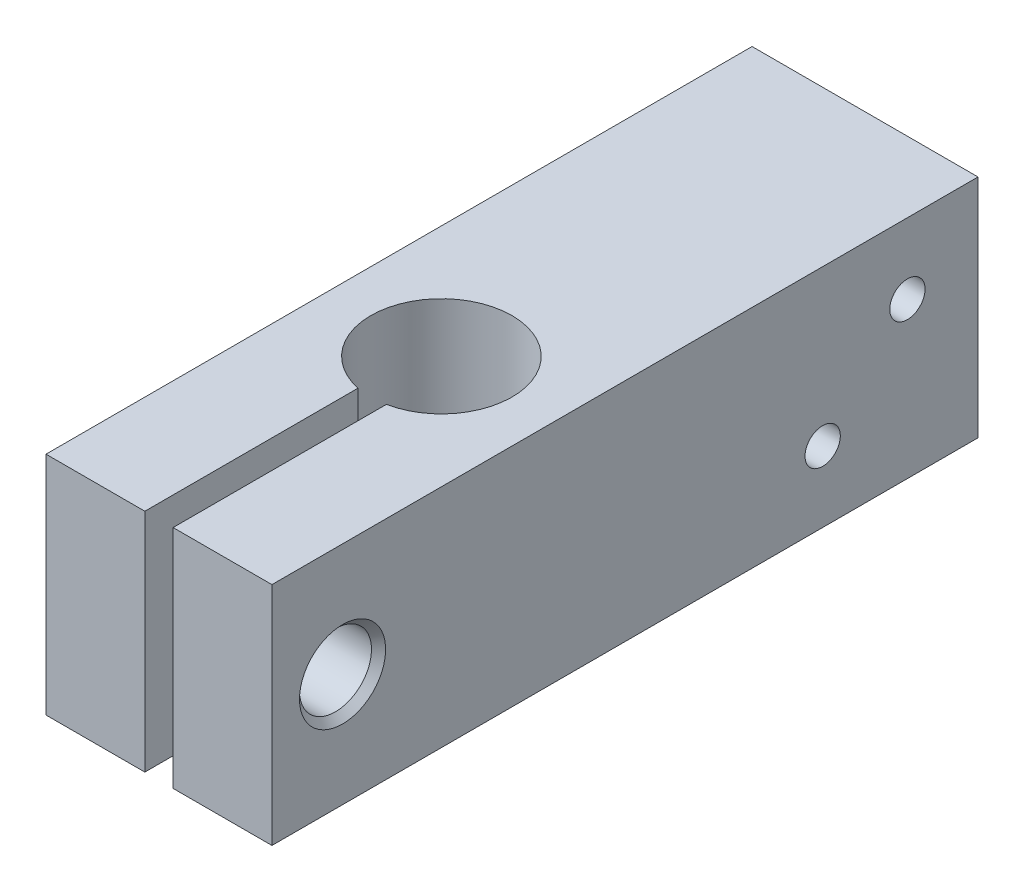
ISO-10303-21;
HEADER;
FILE_DESCRIPTION(('STEP AP214'),'2;1');
FILE_NAME('part.step','',(''),(''),'','','');
FILE_SCHEMA(('AUTOMOTIVE_DESIGN { 1 0 10303 214 1 1 1 1 }'));
ENDSEC;
DATA;
#1=APPLICATION_CONTEXT('core data for automotive mechanical design processes');
#2=APPLICATION_PROTOCOL_DEFINITION('international standard','automotive_design',2000,#1);
#3=PRODUCT_CONTEXT('',#1,'mechanical');
#4=PRODUCT('Part','Part','',(#3));
#5=PRODUCT_RELATED_PRODUCT_CATEGORY('part','',(#4));
#6=PRODUCT_DEFINITION_FORMATION('','',#4);
#7=PRODUCT_DEFINITION_CONTEXT('part definition',#1,'design');
#8=PRODUCT_DEFINITION('design','',#6,#7);
#9=PRODUCT_DEFINITION_SHAPE('','',#8);
#10=(LENGTH_UNIT() NAMED_UNIT(*) SI_UNIT(.MILLI.,.METRE.));
#11=(NAMED_UNIT(*) PLANE_ANGLE_UNIT() SI_UNIT($,.RADIAN.));
#12=(NAMED_UNIT(*) SI_UNIT($,.STERADIAN.) SOLID_ANGLE_UNIT());
#13=UNCERTAINTY_MEASURE_WITH_UNIT(LENGTH_MEASURE(1.E-05),#10,'distance_accuracy_value','');
#14=(GEOMETRIC_REPRESENTATION_CONTEXT(3) GLOBAL_UNCERTAINTY_ASSIGNED_CONTEXT((#13)) GLOBAL_UNIT_ASSIGNED_CONTEXT((#10,
#11,#12)) REPRESENTATION_CONTEXT('',''));
#15=CARTESIAN_POINT('',(0.,0.,0.));
#16=DIRECTION('',(0.,0.,1.));
#17=DIRECTION('',(1.,0.,0.));
#18=AXIS2_PLACEMENT_3D('',#15,#16,#17);
#19=CARTESIAN_POINT('',(0.,0.,50.));
#20=DIRECTION('',(0.,0.,1.));
#21=DIRECTION('',(1.,0.,0.));
#22=AXIS2_PLACEMENT_3D('',#19,#20,#21);
#23=PLANE('',#22);
#24=DIRECTION('',(1.,0.,0.));
#25=VECTOR('',#24,1.);
#26=CARTESIAN_POINT('',(8.,-8.,50.));
#27=LINE('',#26,#25);
#28=CARTESIAN_POINT('',(-8.,-8.,50.));
#29=VERTEX_POINT('',#28);
#30=CARTESIAN_POINT('',(-0.999999999999995,-8.,50.));
#31=VERTEX_POINT('',#30);
#32=EDGE_CURVE('E94',#29,#31,#27,.T.);
#33=ORIENTED_EDGE('',*,*,#32,.T.);
#34=DIRECTION('',(0.,1.,0.));
#35=VECTOR('',#34,1.);
#36=CARTESIAN_POINT('',(-0.999999999999995,-8.,50.));
#37=LINE('',#36,#35);
#38=CARTESIAN_POINT('',(-0.999999999999997,8.,50.));
#39=VERTEX_POINT('',#38);
#40=EDGE_CURVE('E119',#31,#39,#37,.T.);
#41=ORIENTED_EDGE('',*,*,#40,.T.);
#42=DIRECTION('',(-1.,0.,0.));
#43=VECTOR('',#42,1.);
#44=CARTESIAN_POINT('',(8.,8.,50.));
#45=LINE('',#44,#43);
#46=CARTESIAN_POINT('',(-8.,8.,50.));
#47=VERTEX_POINT('',#46);
#48=EDGE_CURVE('E64',#39,#47,#45,.T.);
#49=ORIENTED_EDGE('',*,*,#48,.T.);
#50=DIRECTION('',(0.,-1.,0.));
#51=VECTOR('',#50,1.);
#52=CARTESIAN_POINT('',(-8.,-8.,50.));
#53=LINE('',#52,#51);
#54=EDGE_CURVE('E150',#47,#29,#53,.T.);
#55=ORIENTED_EDGE('',*,*,#54,.T.);
#56=EDGE_LOOP('',(#33,#41,#49,#55));
#57=FACE_BOUND('',#56,.T.);
#58=ADVANCED_FACE('F40',(#57),#23,.T.);
#59=CARTESIAN_POINT('',(-8.,-8.,50.));
#60=DIRECTION('',(1.,0.,0.));
#61=DIRECTION('',(0.,0.,-1.));
#62=AXIS2_PLACEMENT_3D('',#59,#60,#61);
#63=PLANE('',#62);
#64=CARTESIAN_POINT('',(-8.,3.,5.));
#65=DIRECTION('',(-1.,0.,0.));
#66=DIRECTION('',(0.,0.,1.));
#67=AXIS2_PLACEMENT_3D('',#64,#65,#66);
#68=CIRCLE('',#67,1.24999999999999);
#69=CARTESIAN_POINT('',(-8.,3.,6.24999999999999));
#70=VERTEX_POINT('',#69);
#71=EDGE_CURVE('E248',#70,#70,#68,.T.);
#72=ORIENTED_EDGE('',*,*,#71,.F.);
#73=EDGE_LOOP('',(#72));
#74=FACE_BOUND('',#73,.T.);
#75=CARTESIAN_POINT('',(-8.,-3.,11.));
#76=DIRECTION('',(-1.,0.,0.));
#77=DIRECTION('',(0.,0.,1.));
#78=AXIS2_PLACEMENT_3D('',#75,#76,#77);
#79=CIRCLE('',#78,1.24999999999999);
#80=CARTESIAN_POINT('',(-8.,-3.,12.25));
#81=VERTEX_POINT('',#80);
#82=EDGE_CURVE('E250',#81,#81,#79,.T.);
#83=ORIENTED_EDGE('',*,*,#82,.F.);
#84=EDGE_LOOP('',(#83));
#85=FACE_BOUND('',#84,.T.);
#86=CARTESIAN_POINT('',(-8.,0.,45.));
#87=DIRECTION('',(-1.,0.,0.));
#88=DIRECTION('',(0.,0.,1.));
#89=AXIS2_PLACEMENT_3D('',#86,#87,#88);
#90=CIRCLE('',#89,2.1);
#91=CARTESIAN_POINT('',(-8.,0.,47.1));
#92=VERTEX_POINT('',#91);
#93=EDGE_CURVE('E258',#92,#92,#90,.T.);
#94=ORIENTED_EDGE('',*,*,#93,.F.);
#95=EDGE_LOOP('',(#94));
#96=FACE_BOUND('',#95,.T.);
#97=DIRECTION('',(0.,-1.,0.));
#98=VECTOR('',#97,1.);
#99=CARTESIAN_POINT('',(-8.,-8.,0.));
#100=LINE('',#99,#98);
#101=CARTESIAN_POINT('',(-8.,8.,0.));
#102=VERTEX_POINT('',#101);
#103=CARTESIAN_POINT('',(-8.,-8.,0.));
#104=VERTEX_POINT('',#103);
#105=EDGE_CURVE('E146',#102,#104,#100,.T.);
#106=ORIENTED_EDGE('',*,*,#105,.T.);
#107=DIRECTION('',(0.,0.,-1.));
#108=VECTOR('',#107,1.);
#109=CARTESIAN_POINT('',(-8.,-8.,50.));
#110=LINE('',#109,#108);
#111=EDGE_CURVE('E173',#29,#104,#110,.T.);
#112=ORIENTED_EDGE('',*,*,#111,.F.);
#113=ORIENTED_EDGE('',*,*,#54,.F.);
#114=DIRECTION('',(0.,0.,-1.));
#115=VECTOR('',#114,1.);
#116=CARTESIAN_POINT('',(-8.,8.,50.));
#117=LINE('',#116,#115);
#118=EDGE_CURVE('E159',#47,#102,#117,.T.);
#119=ORIENTED_EDGE('',*,*,#118,.T.);
#120=EDGE_LOOP('',(#106,#112,#113,#119));
#121=FACE_BOUND('',#120,.T.);
#122=ADVANCED_FACE('F193',(#74,#85,#96,#121),#63,.F.);
#123=CARTESIAN_POINT('',(8.,-8.,50.));
#124=DIRECTION('',(0.,1.,0.));
#125=DIRECTION('',(-1.,0.,0.));
#126=AXIS2_PLACEMENT_3D('',#123,#124,#125);
#127=PLANE('',#126);
#128=CARTESIAN_POINT('',(1.00000000000001,-8.,50.));
#129=VERTEX_POINT('',#128);
#130=CARTESIAN_POINT('',(8.,-8.,50.));
#131=VERTEX_POINT('',#130);
#132=EDGE_CURVE('E152',#129,#131,#27,.T.);
#133=ORIENTED_EDGE('',*,*,#132,.F.);
#134=DIRECTION('',(0.,0.,-1.));
#135=VECTOR('',#134,1.);
#136=CARTESIAN_POINT('',(1.00000000000001,-8.,0.));
#137=LINE('',#136,#135);
#138=CARTESIAN_POINT('',(1.00000000000001,-8.,34.8989794855664));
#139=VERTEX_POINT('',#138);
#140=EDGE_CURVE('E121',#129,#139,#137,.T.);
#141=ORIENTED_EDGE('',*,*,#140,.T.);
#142=CARTESIAN_POINT('',(0.,-8.,30.));
#143=DIRECTION('',(0.,1.,0.));
#144=DIRECTION('',(-1.,0.,0.));
#145=AXIS2_PLACEMENT_3D('',#142,#143,#144);
#146=CIRCLE('',#145,5.);
#147=CARTESIAN_POINT('',(-0.999999999999997,-8.,34.8989794855664));
#148=VERTEX_POINT('',#147);
#149=EDGE_CURVE('E122',#139,#148,#146,.T.);
#150=ORIENTED_EDGE('',*,*,#149,.T.);
#151=DIRECTION('',(0.,0.,-1.));
#152=VECTOR('',#151,1.);
#153=CARTESIAN_POINT('',(-1.,-8.,0.));
#154=LINE('',#153,#152);
#155=EDGE_CURVE('E114',#31,#148,#154,.T.);
#156=ORIENTED_EDGE('',*,*,#155,.F.);
#157=ORIENTED_EDGE('',*,*,#32,.F.);
#158=ORIENTED_EDGE('',*,*,#111,.T.);
#159=DIRECTION('',(1.,0.,0.));
#160=VECTOR('',#159,1.);
#161=CARTESIAN_POINT('',(8.,-8.,0.));
#162=LINE('',#161,#160);
#163=CARTESIAN_POINT('',(8.,-8.,0.));
#164=VERTEX_POINT('',#163);
#165=EDGE_CURVE('E162',#104,#164,#162,.T.);
#166=ORIENTED_EDGE('',*,*,#165,.T.);
#167=DIRECTION('',(0.,0.,-1.));
#168=VECTOR('',#167,1.);
#169=CARTESIAN_POINT('',(8.,-8.,50.));
#170=LINE('',#169,#168);
#171=EDGE_CURVE('E170',#131,#164,#170,.T.);
#172=ORIENTED_EDGE('',*,*,#171,.F.);
#173=EDGE_LOOP('',(#133,#141,#150,#156,#157,#158,#166,#172));
#174=FACE_BOUND('',#173,.T.);
#175=ADVANCED_FACE('F132',(#174),#127,.F.);
#176=CARTESIAN_POINT('',(8.,-8.,50.));
#177=DIRECTION('',(-1.,0.,0.));
#178=DIRECTION('',(0.,0.,1.));
#179=AXIS2_PLACEMENT_3D('',#176,#177,#178);
#180=PLANE('',#179);
#181=CARTESIAN_POINT('',(8.,3.,5.));
#182=DIRECTION('',(-1.,0.,0.));
#183=DIRECTION('',(0.,0.,1.));
#184=AXIS2_PLACEMENT_3D('',#181,#182,#183);
#185=CIRCLE('',#184,1.25);
#186=CARTESIAN_POINT('',(8.,3.,6.25));
#187=VERTEX_POINT('',#186);
#188=EDGE_CURVE('E245',#187,#187,#185,.T.);
#189=ORIENTED_EDGE('',*,*,#188,.T.);
#190=EDGE_LOOP('',(#189));
#191=FACE_BOUND('',#190,.T.);
#192=CARTESIAN_POINT('',(8.,-3.,11.));
#193=DIRECTION('',(-1.,0.,0.));
#194=DIRECTION('',(0.,0.,1.));
#195=AXIS2_PLACEMENT_3D('',#192,#193,#194);
#196=CIRCLE('',#195,1.25);
#197=CARTESIAN_POINT('',(8.,-3.,12.25));
#198=VERTEX_POINT('',#197);
#199=EDGE_CURVE('E255',#198,#198,#196,.T.);
#200=ORIENTED_EDGE('',*,*,#199,.T.);
#201=EDGE_LOOP('',(#200));
#202=FACE_BOUND('',#201,.T.);
#203=CARTESIAN_POINT('',(8.,0.,45.));
#204=DIRECTION('',(-1.,0.,0.));
#205=DIRECTION('',(0.,0.,1.));
#206=AXIS2_PLACEMENT_3D('',#203,#204,#205);
#207=CIRCLE('',#206,3.04999999999999);
#208=CARTESIAN_POINT('',(8.,0.,48.05));
#209=VERTEX_POINT('',#208);
#210=EDGE_CURVE('E11',#209,#209,#207,.T.);
#211=ORIENTED_EDGE('',*,*,#210,.T.);
#212=EDGE_LOOP('',(#211));
#213=FACE_BOUND('',#212,.T.);
#214=DIRECTION('',(0.,1.,0.));
#215=VECTOR('',#214,1.);
#216=CARTESIAN_POINT('',(8.,-8.,0.));
#217=LINE('',#216,#215);
#218=CARTESIAN_POINT('',(8.,8.,0.));
#219=VERTEX_POINT('',#218);
#220=EDGE_CURVE('E164',#164,#219,#217,.T.);
#221=ORIENTED_EDGE('',*,*,#220,.T.);
#222=DIRECTION('',(0.,0.,-1.));
#223=VECTOR('',#222,1.);
#224=CARTESIAN_POINT('',(8.,8.,50.));
#225=LINE('',#224,#223);
#226=CARTESIAN_POINT('',(8.,8.,50.));
#227=VERTEX_POINT('',#226);
#228=EDGE_CURVE('E168',#227,#219,#225,.T.);
#229=ORIENTED_EDGE('',*,*,#228,.F.);
#230=DIRECTION('',(0.,1.,0.));
#231=VECTOR('',#230,1.);
#232=CARTESIAN_POINT('',(8.,-8.,50.));
#233=LINE('',#232,#231);
#234=EDGE_CURVE('E154',#131,#227,#233,.T.);
#235=ORIENTED_EDGE('',*,*,#234,.F.);
#236=ORIENTED_EDGE('',*,*,#171,.T.);
#237=EDGE_LOOP('',(#221,#229,#235,#236));
#238=FACE_BOUND('',#237,.T.);
#239=ADVANCED_FACE('F211',(#191,#202,#213,#238),#180,.F.);
#240=CARTESIAN_POINT('',(8.,8.,50.));
#241=DIRECTION('',(0.,-1.,0.));
#242=DIRECTION('',(1.,0.,0.));
#243=AXIS2_PLACEMENT_3D('',#240,#241,#242);
#244=PLANE('',#243);
#245=CARTESIAN_POINT('',(0.,8.,30.));
#246=DIRECTION('',(0.,1.,0.));
#247=DIRECTION('',(-1.,0.,0.));
#248=AXIS2_PLACEMENT_3D('',#245,#246,#247);
#249=CIRCLE('',#248,5.);
#250=CARTESIAN_POINT('',(1.,8.,34.8989794855664));
#251=VERTEX_POINT('',#250);
#252=CARTESIAN_POINT('',(-0.999999999999998,8.,34.8989794855664));
#253=VERTEX_POINT('',#252);
#254=EDGE_CURVE('E129',#251,#253,#249,.T.);
#255=ORIENTED_EDGE('',*,*,#254,.F.);
#256=DIRECTION('',(0.,0.,-1.));
#257=VECTOR('',#256,1.);
#258=CARTESIAN_POINT('',(1.00000000000001,8.,0.));
#259=LINE('',#258,#257);
#260=CARTESIAN_POINT('',(1.00000000000001,8.,50.));
#261=VERTEX_POINT('',#260);
#262=EDGE_CURVE('E133',#261,#251,#259,.T.);
#263=ORIENTED_EDGE('',*,*,#262,.F.);
#264=EDGE_CURVE('E156',#227,#261,#45,.T.);
#265=ORIENTED_EDGE('',*,*,#264,.F.);
#266=ORIENTED_EDGE('',*,*,#228,.T.);
#267=DIRECTION('',(-1.,0.,0.));
#268=VECTOR('',#267,1.);
#269=CARTESIAN_POINT('',(8.,8.,0.));
#270=LINE('',#269,#268);
#271=EDGE_CURVE('E86',#219,#102,#270,.T.);
#272=ORIENTED_EDGE('',*,*,#271,.T.);
#273=ORIENTED_EDGE('',*,*,#118,.F.);
#274=ORIENTED_EDGE('',*,*,#48,.F.);
#275=DIRECTION('',(0.,0.,-1.));
#276=VECTOR('',#275,1.);
#277=CARTESIAN_POINT('',(-1.00000000000001,8.,0.));
#278=LINE('',#277,#276);
#279=EDGE_CURVE('E56',#39,#253,#278,.T.);
#280=ORIENTED_EDGE('',*,*,#279,.T.);
#281=EDGE_LOOP('',(#255,#263,#265,#266,#272,#273,#274,#280));
#282=FACE_BOUND('',#281,.T.);
#283=ADVANCED_FACE('F204',(#282),#244,.F.);
#284=DIRECTION('',(0.,1.,0.));
#285=VECTOR('',#284,1.);
#286=CARTESIAN_POINT('',(1.00000000000001,-8.,50.));
#287=LINE('',#286,#285);
#288=EDGE_CURVE('E147',#129,#261,#287,.T.);
#289=ORIENTED_EDGE('',*,*,#288,.F.);
#290=ORIENTED_EDGE('',*,*,#132,.T.);
#291=ORIENTED_EDGE('',*,*,#234,.T.);
#292=ORIENTED_EDGE('',*,*,#264,.T.);
#293=EDGE_LOOP('',(#289,#290,#291,#292));
#294=FACE_BOUND('',#293,.T.);
#295=ADVANCED_FACE('F195',(#294),#23,.T.);
#296=CARTESIAN_POINT('',(0.,0.,0.));
#297=DIRECTION('',(0.,0.,1.));
#298=DIRECTION('',(1.,0.,0.));
#299=AXIS2_PLACEMENT_3D('',#296,#297,#298);
#300=PLANE('',#299);
#301=ORIENTED_EDGE('',*,*,#105,.F.);
#302=ORIENTED_EDGE('',*,*,#271,.F.);
#303=ORIENTED_EDGE('',*,*,#220,.F.);
#304=ORIENTED_EDGE('',*,*,#165,.F.);
#305=EDGE_LOOP('',(#301,#302,#303,#304));
#306=FACE_BOUND('',#305,.T.);
#307=ADVANCED_FACE('F203',(#306),#300,.F.);
#308=CARTESIAN_POINT('',(0.,-8.,30.));
#309=DIRECTION('',(0.,1.,0.));
#310=DIRECTION('',(-1.,0.,0.));
#311=AXIS2_PLACEMENT_3D('',#308,#309,#310);
#312=CYLINDRICAL_SURFACE('',#311,5.);
#313=ORIENTED_EDGE('',*,*,#254,.T.);
#314=DIRECTION('',(0.,1.,0.));
#315=VECTOR('',#314,1.);
#316=CARTESIAN_POINT('',(-0.999999999999997,-8.,34.8989794855664));
#317=LINE('',#316,#315);
#318=EDGE_CURVE('E117',#148,#253,#317,.T.);
#319=ORIENTED_EDGE('',*,*,#318,.F.);
#320=ORIENTED_EDGE('',*,*,#149,.F.);
#321=DIRECTION('',(0.,1.,0.));
#322=VECTOR('',#321,1.);
#323=CARTESIAN_POINT('',(1.00000000000001,-8.,34.8989794855664));
#324=LINE('',#323,#322);
#325=EDGE_CURVE('E144',#139,#251,#324,.T.);
#326=ORIENTED_EDGE('',*,*,#325,.T.);
#327=EDGE_LOOP('',(#313,#319,#320,#326));
#328=FACE_BOUND('',#327,.T.);
#329=ADVANCED_FACE('F126',(#328),#312,.F.);
#330=CARTESIAN_POINT('',(1.00000000000001,-8.,0.));
#331=DIRECTION('',(1.,0.,0.));
#332=DIRECTION('',(0.,1.,0.));
#333=AXIS2_PLACEMENT_3D('',#330,#331,#332);
#334=PLANE('',#333);
#335=CARTESIAN_POINT('',(1.,0.,45.));
#336=DIRECTION('',(1.,0.,0.));
#337=DIRECTION('',(0.,1.,0.));
#338=AXIS2_PLACEMENT_3D('',#335,#336,#337);
#339=CIRCLE('',#338,2.55);
#340=CARTESIAN_POINT('',(1.,2.55,45.));
#341=VERTEX_POINT('',#340);
#342=EDGE_CURVE('E138',#341,#341,#339,.F.);
#343=ORIENTED_EDGE('',*,*,#342,.F.);
#344=EDGE_LOOP('',(#343));
#345=FACE_BOUND('',#344,.T.);
#346=ORIENTED_EDGE('',*,*,#262,.T.);
#347=ORIENTED_EDGE('',*,*,#325,.F.);
#348=ORIENTED_EDGE('',*,*,#140,.F.);
#349=ORIENTED_EDGE('',*,*,#288,.T.);
#350=EDGE_LOOP('',(#346,#347,#348,#349));
#351=FACE_BOUND('',#350,.T.);
#352=ADVANCED_FACE('F222',(#345,#351),#334,.F.);
#353=CARTESIAN_POINT('',(-1.,-8.,0.));
#354=DIRECTION('',(1.,0.,0.));
#355=DIRECTION('',(0.,0.,-1.));
#356=AXIS2_PLACEMENT_3D('',#353,#354,#355);
#357=PLANE('',#356);
#358=CARTESIAN_POINT('',(-0.999999999999995,0.,45.));
#359=DIRECTION('',(1.,0.,0.));
#360=DIRECTION('',(0.,0.,-1.));
#361=AXIS2_PLACEMENT_3D('',#358,#359,#360);
#362=CIRCLE('',#361,2.1);
#363=CARTESIAN_POINT('',(-0.999999999999995,0.,42.9));
#364=VERTEX_POINT('',#363);
#365=EDGE_CURVE('E260',#364,#364,#362,.T.);
#366=ORIENTED_EDGE('',*,*,#365,.F.);
#367=EDGE_LOOP('',(#366));
#368=FACE_BOUND('',#367,.T.);
#369=ORIENTED_EDGE('',*,*,#279,.F.);
#370=ORIENTED_EDGE('',*,*,#40,.F.);
#371=ORIENTED_EDGE('',*,*,#155,.T.);
#372=ORIENTED_EDGE('',*,*,#318,.T.);
#373=EDGE_LOOP('',(#369,#370,#371,#372));
#374=FACE_BOUND('',#373,.T.);
#375=ADVANCED_FACE('F116',(#368,#374),#357,.T.);
#376=CARTESIAN_POINT('',(-8.001,0.,45.));
#377=DIRECTION('',(1.,0.,0.));
#378=DIRECTION('',(0.,0.,-1.));
#379=AXIS2_PLACEMENT_3D('',#376,#377,#378);
#380=CYLINDRICAL_SURFACE('',#379,2.55);
#381=CARTESIAN_POINT('',(7.50000000000002,0.,45.));
#382=DIRECTION('',(-1.,0.,0.));
#383=DIRECTION('',(0.,0.,1.));
#384=AXIS2_PLACEMENT_3D('',#381,#382,#383);
#385=CIRCLE('',#384,2.55);
#386=CARTESIAN_POINT('',(7.50000000000002,0.,47.55));
#387=VERTEX_POINT('',#386);
#388=EDGE_CURVE('E49',#387,#387,#385,.F.);
#389=ORIENTED_EDGE('',*,*,#388,.T.);
#390=EDGE_LOOP('',(#389));
#391=FACE_BOUND('',#390,.T.);
#392=ORIENTED_EDGE('',*,*,#342,.T.);
#393=EDGE_LOOP('',(#392));
#394=FACE_BOUND('',#393,.T.);
#395=ADVANCED_FACE('F177',(#391,#394),#380,.F.);
#396=CARTESIAN_POINT('',(7.50000000000002,0.,45.));
#397=DIRECTION('',(1.,0.,0.));
#398=DIRECTION('',(0.,0.,-1.));
#399=AXIS2_PLACEMENT_3D('',#396,#397,#398);
#400=CONICAL_SURFACE('',#399,2.55,0.785398163397453);
#401=ORIENTED_EDGE('',*,*,#210,.F.);
#402=EDGE_LOOP('',(#401));
#403=FACE_BOUND('',#402,.T.);
#404=ORIENTED_EDGE('',*,*,#388,.F.);
#405=EDGE_LOOP('',(#404));
#406=FACE_BOUND('',#405,.T.);
#407=ADVANCED_FACE('F43',(#403,#406),#400,.F.);
#408=CARTESIAN_POINT('',(-8.,0.,45.));
#409=DIRECTION('',(-1.,0.,0.));
#410=DIRECTION('',(0.,0.,1.));
#411=AXIS2_PLACEMENT_3D('',#408,#409,#410);
#412=CYLINDRICAL_SURFACE('',#411,2.1);
#413=ORIENTED_EDGE('',*,*,#365,.T.);
#414=EDGE_LOOP('',(#413));
#415=FACE_BOUND('',#414,.T.);
#416=ORIENTED_EDGE('',*,*,#93,.T.);
#417=EDGE_LOOP('',(#416));
#418=FACE_BOUND('',#417,.T.);
#419=ADVANCED_FACE('F181',(#415,#418),#412,.F.);
#420=CARTESIAN_POINT('',(-8.,-3.,11.));
#421=DIRECTION('',(-1.,0.,0.));
#422=DIRECTION('',(0.,0.,1.));
#423=AXIS2_PLACEMENT_3D('',#420,#421,#422);
#424=CYLINDRICAL_SURFACE('',#423,1.24999999999999);
#425=ORIENTED_EDGE('',*,*,#199,.F.);
#426=EDGE_LOOP('',(#425));
#427=FACE_BOUND('',#426,.T.);
#428=ORIENTED_EDGE('',*,*,#82,.T.);
#429=EDGE_LOOP('',(#428));
#430=FACE_BOUND('',#429,.T.);
#431=ADVANCED_FACE('F187',(#427,#430),#424,.F.);
#432=CARTESIAN_POINT('',(-8.,3.,5.));
#433=DIRECTION('',(-1.,0.,0.));
#434=DIRECTION('',(0.,0.,1.));
#435=AXIS2_PLACEMENT_3D('',#432,#433,#434);
#436=CYLINDRICAL_SURFACE('',#435,1.24999999999999);
#437=ORIENTED_EDGE('',*,*,#188,.F.);
#438=EDGE_LOOP('',(#437));
#439=FACE_BOUND('',#438,.T.);
#440=ORIENTED_EDGE('',*,*,#71,.T.);
#441=EDGE_LOOP('',(#440));
#442=FACE_BOUND('',#441,.T.);
#443=ADVANCED_FACE('F236',(#439,#442),#436,.F.);
#444=CLOSED_SHELL('',(#58,#122,#175,#239,#283,#295,#307,#329,#352,#375,#395,#407,#419,#431,#443));
#445=MANIFOLD_SOLID_BREP('B2',#444);
#446=ADVANCED_BREP_SHAPE_REPRESENTATION('',(#18,#445),#14);
#447=SHAPE_DEFINITION_REPRESENTATION(#9,#446);
ENDSEC;
END-ISO-10303-21;
